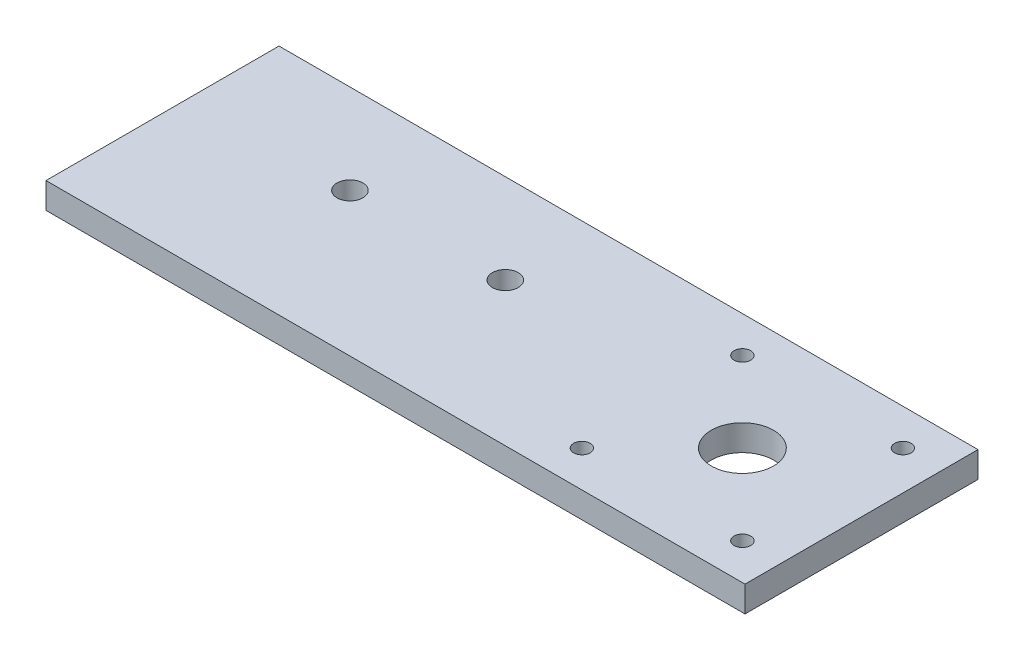
ISO-10303-21;
HEADER;
FILE_DESCRIPTION(('STEP AP214'),'2;1');
FILE_NAME('part.step','',(''),(''),'','','');
FILE_SCHEMA(('AUTOMOTIVE_DESIGN { 1 0 10303 214 1 1 1 1 }'));
ENDSEC;
DATA;
#1=APPLICATION_CONTEXT('core data for automotive mechanical design processes');
#2=APPLICATION_PROTOCOL_DEFINITION('international standard','automotive_design',2000,#1);
#3=PRODUCT_CONTEXT('',#1,'mechanical');
#4=PRODUCT('Part','Part','',(#3));
#5=PRODUCT_RELATED_PRODUCT_CATEGORY('part','',(#4));
#6=PRODUCT_DEFINITION_FORMATION('','',#4);
#7=PRODUCT_DEFINITION_CONTEXT('part definition',#1,'design');
#8=PRODUCT_DEFINITION('design','',#6,#7);
#9=PRODUCT_DEFINITION_SHAPE('','',#8);
#10=(LENGTH_UNIT() NAMED_UNIT(*) SI_UNIT(.MILLI.,.METRE.));
#11=(NAMED_UNIT(*) PLANE_ANGLE_UNIT() SI_UNIT($,.RADIAN.));
#12=(NAMED_UNIT(*) SI_UNIT($,.STERADIAN.) SOLID_ANGLE_UNIT());
#13=UNCERTAINTY_MEASURE_WITH_UNIT(LENGTH_MEASURE(1.E-05),#10,'distance_accuracy_value','');
#14=(GEOMETRIC_REPRESENTATION_CONTEXT(3) GLOBAL_UNCERTAINTY_ASSIGNED_CONTEXT((#13)) GLOBAL_UNIT_ASSIGNED_CONTEXT((#10,
#11,#12)) REPRESENTATION_CONTEXT('',''));
#15=CARTESIAN_POINT('',(0.,0.,0.));
#16=DIRECTION('',(0.,0.,1.));
#17=DIRECTION('',(1.,0.,0.));
#18=AXIS2_PLACEMENT_3D('',#15,#16,#17);
#19=CARTESIAN_POINT('',(67.5,5.,-22.5));
#20=DIRECTION('',(-1.,0.,0.));
#21=DIRECTION('',(0.,0.,1.));
#22=AXIS2_PLACEMENT_3D('',#19,#20,#21);
#23=PLANE('',#22);
#24=DIRECTION('',(0.,0.,-1.));
#25=VECTOR('',#24,1.);
#26=CARTESIAN_POINT('',(67.5,0.,-22.5));
#27=LINE('',#26,#25);
#28=CARTESIAN_POINT('',(67.5,0.,22.5));
#29=VERTEX_POINT('',#28);
#30=CARTESIAN_POINT('',(67.5,0.,-22.5));
#31=VERTEX_POINT('',#30);
#32=EDGE_CURVE('E107',#29,#31,#27,.T.);
#33=ORIENTED_EDGE('',*,*,#32,.T.);
#34=DIRECTION('',(0.,-1.,0.));
#35=VECTOR('',#34,1.);
#36=CARTESIAN_POINT('',(67.5,5.,-22.5));
#37=LINE('',#36,#35);
#38=CARTESIAN_POINT('',(67.5,5.,-22.5));
#39=VERTEX_POINT('',#38);
#40=EDGE_CURVE('E13',#39,#31,#37,.T.);
#41=ORIENTED_EDGE('',*,*,#40,.F.);
#42=DIRECTION('',(0.,0.,-1.));
#43=VECTOR('',#42,1.);
#44=CARTESIAN_POINT('',(67.5,5.,-22.5));
#45=LINE('',#44,#43);
#46=CARTESIAN_POINT('',(67.5,5.,22.5));
#47=VERTEX_POINT('',#46);
#48=EDGE_CURVE('E95',#47,#39,#45,.T.);
#49=ORIENTED_EDGE('',*,*,#48,.F.);
#50=DIRECTION('',(0.,-1.,0.));
#51=VECTOR('',#50,1.);
#52=CARTESIAN_POINT('',(67.5,5.,22.5));
#53=LINE('',#52,#51);
#54=EDGE_CURVE('E103',#47,#29,#53,.T.);
#55=ORIENTED_EDGE('',*,*,#54,.T.);
#56=EDGE_LOOP('',(#33,#41,#49,#55));
#57=FACE_BOUND('',#56,.T.);
#58=ADVANCED_FACE('F44',(#57),#23,.F.);
#59=CARTESIAN_POINT('',(-67.5,5.,-22.5));
#60=DIRECTION('',(0.,0.,1.));
#61=DIRECTION('',(1.,0.,0.));
#62=AXIS2_PLACEMENT_3D('',#59,#60,#61);
#63=PLANE('',#62);
#64=DIRECTION('',(-1.,0.,0.));
#65=VECTOR('',#64,1.);
#66=CARTESIAN_POINT('',(-67.5,0.,-22.5));
#67=LINE('',#66,#65);
#68=CARTESIAN_POINT('',(-67.5,0.,-22.5));
#69=VERTEX_POINT('',#68);
#70=EDGE_CURVE('E99',#31,#69,#67,.T.);
#71=ORIENTED_EDGE('',*,*,#70,.T.);
#72=DIRECTION('',(0.,-1.,0.));
#73=VECTOR('',#72,1.);
#74=CARTESIAN_POINT('',(-67.5,5.,-22.5));
#75=LINE('',#74,#73);
#76=CARTESIAN_POINT('',(-67.5,5.,-22.5));
#77=VERTEX_POINT('',#76);
#78=EDGE_CURVE('E52',#77,#69,#75,.T.);
#79=ORIENTED_EDGE('',*,*,#78,.F.);
#80=DIRECTION('',(-1.,0.,0.));
#81=VECTOR('',#80,1.);
#82=CARTESIAN_POINT('',(-67.5,5.,-22.5));
#83=LINE('',#82,#81);
#84=EDGE_CURVE('E90',#39,#77,#83,.T.);
#85=ORIENTED_EDGE('',*,*,#84,.F.);
#86=ORIENTED_EDGE('',*,*,#40,.T.);
#87=EDGE_LOOP('',(#71,#79,#85,#86));
#88=FACE_BOUND('',#87,.T.);
#89=ADVANCED_FACE('F98',(#88),#63,.F.);
#90=CARTESIAN_POINT('',(-67.5,5.,-22.5));
#91=DIRECTION('',(1.,0.,0.));
#92=DIRECTION('',(0.,0.,-1.));
#93=AXIS2_PLACEMENT_3D('',#90,#91,#92);
#94=PLANE('',#93);
#95=DIRECTION('',(0.,0.,1.));
#96=VECTOR('',#95,1.);
#97=CARTESIAN_POINT('',(-67.5,0.,-22.5));
#98=LINE('',#97,#96);
#99=CARTESIAN_POINT('',(-67.5,0.,22.5));
#100=VERTEX_POINT('',#99);
#101=EDGE_CURVE('E77',#69,#100,#98,.T.);
#102=ORIENTED_EDGE('',*,*,#101,.T.);
#103=DIRECTION('',(0.,-1.,0.));
#104=VECTOR('',#103,1.);
#105=CARTESIAN_POINT('',(-67.5,5.,22.5));
#106=LINE('',#105,#104);
#107=CARTESIAN_POINT('',(-67.5,5.,22.5));
#108=VERTEX_POINT('',#107);
#109=EDGE_CURVE('E100',#108,#100,#106,.T.);
#110=ORIENTED_EDGE('',*,*,#109,.F.);
#111=DIRECTION('',(0.,0.,1.));
#112=VECTOR('',#111,1.);
#113=CARTESIAN_POINT('',(-67.5,5.,-22.5));
#114=LINE('',#113,#112);
#115=EDGE_CURVE('E93',#77,#108,#114,.T.);
#116=ORIENTED_EDGE('',*,*,#115,.F.);
#117=ORIENTED_EDGE('',*,*,#78,.T.);
#118=EDGE_LOOP('',(#102,#110,#116,#117));
#119=FACE_BOUND('',#118,.T.);
#120=ADVANCED_FACE('F101',(#119),#94,.F.);
#121=CARTESIAN_POINT('',(-67.5,5.,22.5));
#122=DIRECTION('',(0.,0.,-1.));
#123=DIRECTION('',(-1.,0.,0.));
#124=AXIS2_PLACEMENT_3D('',#121,#122,#123);
#125=PLANE('',#124);
#126=DIRECTION('',(1.,0.,0.));
#127=VECTOR('',#126,1.);
#128=CARTESIAN_POINT('',(-67.5,0.,22.5));
#129=LINE('',#128,#127);
#130=EDGE_CURVE('E83',#100,#29,#129,.T.);
#131=ORIENTED_EDGE('',*,*,#130,.T.);
#132=ORIENTED_EDGE('',*,*,#54,.F.);
#133=DIRECTION('',(1.,0.,0.));
#134=VECTOR('',#133,1.);
#135=CARTESIAN_POINT('',(-67.5,5.,22.5));
#136=LINE('',#135,#134);
#137=EDGE_CURVE('E60',#108,#47,#136,.T.);
#138=ORIENTED_EDGE('',*,*,#137,.F.);
#139=ORIENTED_EDGE('',*,*,#109,.T.);
#140=EDGE_LOOP('',(#131,#132,#138,#139));
#141=FACE_BOUND('',#140,.T.);
#142=ADVANCED_FACE('F115',(#141),#125,.F.);
#143=CARTESIAN_POINT('',(0.,5.,0.));
#144=DIRECTION('',(0.,1.,0.));
#145=DIRECTION('',(0.,0.,1.));
#146=AXIS2_PLACEMENT_3D('',#143,#144,#145);
#147=PLANE('',#146);
#148=CARTESIAN_POINT('',(60.,5.,15.5025407257454));
#149=DIRECTION('',(0.,-1.,0.));
#150=DIRECTION('',(0.,0.,-1.));
#151=AXIS2_PLACEMENT_3D('',#148,#149,#150);
#152=CIRCLE('',#151,1.6);
#153=CARTESIAN_POINT('',(60.,5.,13.9025407257454));
#154=VERTEX_POINT('',#153);
#155=EDGE_CURVE('E136',#154,#154,#152,.T.);
#156=ORIENTED_EDGE('',*,*,#155,.T.);
#157=EDGE_LOOP('',(#156));
#158=FACE_BOUND('',#157,.T.);
#159=CARTESIAN_POINT('',(29.,5.,15.5025407257454));
#160=DIRECTION('',(0.,-1.,0.));
#161=DIRECTION('',(0.,0.,-1.));
#162=AXIS2_PLACEMENT_3D('',#159,#160,#161);
#163=CIRCLE('',#162,1.6);
#164=CARTESIAN_POINT('',(29.,5.,13.9025407257454));
#165=VERTEX_POINT('',#164);
#166=EDGE_CURVE('E154',#165,#165,#163,.T.);
#167=ORIENTED_EDGE('',*,*,#166,.T.);
#168=EDGE_LOOP('',(#167));
#169=FACE_BOUND('',#168,.T.);
#170=CARTESIAN_POINT('',(29.,5.,-15.4974592742546));
#171=DIRECTION('',(0.,-1.,0.));
#172=DIRECTION('',(0.,0.,-1.));
#173=AXIS2_PLACEMENT_3D('',#170,#171,#172);
#174=CIRCLE('',#173,1.6);
#175=CARTESIAN_POINT('',(29.,5.,-17.0974592742546));
#176=VERTEX_POINT('',#175);
#177=EDGE_CURVE('E148',#176,#176,#174,.T.);
#178=ORIENTED_EDGE('',*,*,#177,.T.);
#179=EDGE_LOOP('',(#178));
#180=FACE_BOUND('',#179,.T.);
#181=CARTESIAN_POINT('',(60.,5.,-15.4974592742546));
#182=DIRECTION('',(0.,-1.,0.));
#183=DIRECTION('',(0.,0.,-1.));
#184=AXIS2_PLACEMENT_3D('',#181,#182,#183);
#185=CIRCLE('',#184,1.6);
#186=CARTESIAN_POINT('',(60.,5.,-17.0974592742546));
#187=VERTEX_POINT('',#186);
#188=EDGE_CURVE('E142',#187,#187,#185,.T.);
#189=ORIENTED_EDGE('',*,*,#188,.T.);
#190=EDGE_LOOP('',(#189));
#191=FACE_BOUND('',#190,.T.);
#192=CARTESIAN_POINT('',(44.5000000000001,5.,0.00254072574537578));
#193=DIRECTION('',(0.,-1.,0.));
#194=DIRECTION('',(0.,0.,-1.));
#195=AXIS2_PLACEMENT_3D('',#192,#193,#194);
#196=CIRCLE('',#195,6.);
#197=CARTESIAN_POINT('',(44.5000000000001,5.,-5.99745927425463));
#198=VERTEX_POINT('',#197);
#199=EDGE_CURVE('E130',#198,#198,#196,.T.);
#200=ORIENTED_EDGE('',*,*,#199,.T.);
#201=EDGE_LOOP('',(#200));
#202=FACE_BOUND('',#201,.T.);
#203=CARTESIAN_POINT('',(-6.49618891138249,5.,-5.19872963712735));
#204=DIRECTION('',(0.,1.,0.));
#205=DIRECTION('',(0.,0.,1.));
#206=AXIS2_PLACEMENT_3D('',#203,#204,#205);
#207=CIRCLE('',#206,2.5);
#208=CARTESIAN_POINT('',(-6.49618891138249,5.,-2.69872963712735));
#209=VERTEX_POINT('',#208);
#210=EDGE_CURVE('E127',#209,#209,#207,.F.);
#211=ORIENTED_EDGE('',*,*,#210,.T.);
#212=EDGE_LOOP('',(#211));
#213=FACE_BOUND('',#212,.T.);
#214=CARTESIAN_POINT('',(-36.4987296371275,5.,-5.19872963712732));
#215=DIRECTION('',(0.,1.,0.));
#216=DIRECTION('',(0.,0.,1.));
#217=AXIS2_PLACEMENT_3D('',#214,#215,#216);
#218=CIRCLE('',#217,2.5);
#219=CARTESIAN_POINT('',(-36.4987296371275,5.,-2.69872963712732));
#220=VERTEX_POINT('',#219);
#221=EDGE_CURVE('E121',#220,#220,#218,.F.);
#222=ORIENTED_EDGE('',*,*,#221,.T.);
#223=EDGE_LOOP('',(#222));
#224=FACE_BOUND('',#223,.T.);
#225=ORIENTED_EDGE('',*,*,#48,.T.);
#226=ORIENTED_EDGE('',*,*,#84,.T.);
#227=ORIENTED_EDGE('',*,*,#115,.T.);
#228=ORIENTED_EDGE('',*,*,#137,.T.);
#229=EDGE_LOOP('',(#225,#226,#227,#228));
#230=FACE_BOUND('',#229,.T.);
#231=ADVANCED_FACE('F91',(#158,#169,#180,#191,#202,#213,#224,#230),#147,.T.);
#232=CARTESIAN_POINT('',(0.,0.,0.));
#233=DIRECTION('',(0.,1.,0.));
#234=DIRECTION('',(0.,0.,1.));
#235=AXIS2_PLACEMENT_3D('',#232,#233,#234);
#236=PLANE('',#235);
#237=CARTESIAN_POINT('',(60.,0.,15.5025407257454));
#238=DIRECTION('',(0.,-1.,0.));
#239=DIRECTION('',(0.,0.,-1.));
#240=AXIS2_PLACEMENT_3D('',#237,#238,#239);
#241=CIRCLE('',#240,1.6);
#242=CARTESIAN_POINT('',(60.,0.,13.9025407257454));
#243=VERTEX_POINT('',#242);
#244=EDGE_CURVE('E157',#243,#243,#241,.T.);
#245=ORIENTED_EDGE('',*,*,#244,.F.);
#246=EDGE_LOOP('',(#245));
#247=FACE_BOUND('',#246,.T.);
#248=CARTESIAN_POINT('',(29.,0.,15.5025407257454));
#249=DIRECTION('',(0.,-1.,0.));
#250=DIRECTION('',(0.,0.,-1.));
#251=AXIS2_PLACEMENT_3D('',#248,#249,#250);
#252=CIRCLE('',#251,1.6);
#253=CARTESIAN_POINT('',(29.,0.,13.9025407257454));
#254=VERTEX_POINT('',#253);
#255=EDGE_CURVE('E151',#254,#254,#252,.T.);
#256=ORIENTED_EDGE('',*,*,#255,.F.);
#257=EDGE_LOOP('',(#256));
#258=FACE_BOUND('',#257,.T.);
#259=CARTESIAN_POINT('',(29.,0.,-15.4974592742546));
#260=DIRECTION('',(0.,-1.,0.));
#261=DIRECTION('',(0.,0.,-1.));
#262=AXIS2_PLACEMENT_3D('',#259,#260,#261);
#263=CIRCLE('',#262,1.6);
#264=CARTESIAN_POINT('',(29.,0.,-17.0974592742546));
#265=VERTEX_POINT('',#264);
#266=EDGE_CURVE('E145',#265,#265,#263,.T.);
#267=ORIENTED_EDGE('',*,*,#266,.F.);
#268=EDGE_LOOP('',(#267));
#269=FACE_BOUND('',#268,.T.);
#270=CARTESIAN_POINT('',(60.,0.,-15.4974592742546));
#271=DIRECTION('',(0.,-1.,0.));
#272=DIRECTION('',(0.,0.,-1.));
#273=AXIS2_PLACEMENT_3D('',#270,#271,#272);
#274=CIRCLE('',#273,1.6);
#275=CARTESIAN_POINT('',(60.,0.,-17.0974592742546));
#276=VERTEX_POINT('',#275);
#277=EDGE_CURVE('E139',#276,#276,#274,.T.);
#278=ORIENTED_EDGE('',*,*,#277,.F.);
#279=EDGE_LOOP('',(#278));
#280=FACE_BOUND('',#279,.T.);
#281=CARTESIAN_POINT('',(44.5000000000001,0.,0.00254072574537578));
#282=DIRECTION('',(0.,-1.,0.));
#283=DIRECTION('',(0.,0.,-1.));
#284=AXIS2_PLACEMENT_3D('',#281,#282,#283);
#285=CIRCLE('',#284,6.);
#286=CARTESIAN_POINT('',(44.5000000000001,0.,-5.99745927425463));
#287=VERTEX_POINT('',#286);
#288=EDGE_CURVE('E133',#287,#287,#285,.T.);
#289=ORIENTED_EDGE('',*,*,#288,.F.);
#290=EDGE_LOOP('',(#289));
#291=FACE_BOUND('',#290,.T.);
#292=CARTESIAN_POINT('',(-6.49618891138249,0.,-5.19872963712735));
#293=DIRECTION('',(0.,-1.,0.));
#294=DIRECTION('',(0.,0.,-1.));
#295=AXIS2_PLACEMENT_3D('',#292,#293,#294);
#296=CIRCLE('',#295,2.5);
#297=CARTESIAN_POINT('',(-6.49618891138249,0.,-7.69872963712735));
#298=VERTEX_POINT('',#297);
#299=EDGE_CURVE('E124',#298,#298,#296,.T.);
#300=ORIENTED_EDGE('',*,*,#299,.F.);
#301=EDGE_LOOP('',(#300));
#302=FACE_BOUND('',#301,.T.);
#303=CARTESIAN_POINT('',(-36.4987296371275,0.,-5.19872963712732));
#304=DIRECTION('',(0.,-1.,0.));
#305=DIRECTION('',(0.,0.,-1.));
#306=AXIS2_PLACEMENT_3D('',#303,#304,#305);
#307=CIRCLE('',#306,2.5);
#308=CARTESIAN_POINT('',(-36.4987296371275,0.,-7.69872963712732));
#309=VERTEX_POINT('',#308);
#310=EDGE_CURVE('E110',#309,#309,#307,.T.);
#311=ORIENTED_EDGE('',*,*,#310,.F.);
#312=EDGE_LOOP('',(#311));
#313=FACE_BOUND('',#312,.T.);
#314=ORIENTED_EDGE('',*,*,#32,.F.);
#315=ORIENTED_EDGE('',*,*,#130,.F.);
#316=ORIENTED_EDGE('',*,*,#101,.F.);
#317=ORIENTED_EDGE('',*,*,#70,.F.);
#318=EDGE_LOOP('',(#314,#315,#316,#317));
#319=FACE_BOUND('',#318,.T.);
#320=ADVANCED_FACE('F118',(#247,#258,#269,#280,#291,#302,#313,#319),#236,.F.);
#321=CARTESIAN_POINT('',(-36.4987296371275,5.00099999999998,-5.19872963712732));
#322=DIRECTION('',(0.,-1.,0.));
#323=DIRECTION('',(0.,0.,-1.));
#324=AXIS2_PLACEMENT_3D('',#321,#322,#323);
#325=CYLINDRICAL_SURFACE('',#324,2.5);
#326=ORIENTED_EDGE('',*,*,#221,.F.);
#327=EDGE_LOOP('',(#326));
#328=FACE_BOUND('',#327,.T.);
#329=ORIENTED_EDGE('',*,*,#310,.T.);
#330=EDGE_LOOP('',(#329));
#331=FACE_BOUND('',#330,.T.);
#332=ADVANCED_FACE('F174',(#328,#331),#325,.F.);
#333=CARTESIAN_POINT('',(-6.49618891138249,5.00099999999998,-5.19872963712735));
#334=DIRECTION('',(0.,-1.,0.));
#335=DIRECTION('',(0.,0.,-1.));
#336=AXIS2_PLACEMENT_3D('',#333,#334,#335);
#337=CYLINDRICAL_SURFACE('',#336,2.5);
#338=ORIENTED_EDGE('',*,*,#210,.F.);
#339=EDGE_LOOP('',(#338));
#340=FACE_BOUND('',#339,.T.);
#341=ORIENTED_EDGE('',*,*,#299,.T.);
#342=EDGE_LOOP('',(#341));
#343=FACE_BOUND('',#342,.T.);
#344=ADVANCED_FACE('F189',(#340,#343),#337,.F.);
#345=CARTESIAN_POINT('',(44.5000000000001,5.,0.00254072574537578));
#346=DIRECTION('',(0.,-1.,0.));
#347=DIRECTION('',(0.,0.,-1.));
#348=AXIS2_PLACEMENT_3D('',#345,#346,#347);
#349=CYLINDRICAL_SURFACE('',#348,6.);
#350=ORIENTED_EDGE('',*,*,#199,.F.);
#351=EDGE_LOOP('',(#350));
#352=FACE_BOUND('',#351,.T.);
#353=ORIENTED_EDGE('',*,*,#288,.T.);
#354=EDGE_LOOP('',(#353));
#355=FACE_BOUND('',#354,.T.);
#356=ADVANCED_FACE('F195',(#352,#355),#349,.F.);
#357=CARTESIAN_POINT('',(60.,5.,-15.4974592742546));
#358=DIRECTION('',(0.,-1.,0.));
#359=DIRECTION('',(0.,0.,-1.));
#360=AXIS2_PLACEMENT_3D('',#357,#358,#359);
#361=CYLINDRICAL_SURFACE('',#360,1.6);
#362=ORIENTED_EDGE('',*,*,#188,.F.);
#363=EDGE_LOOP('',(#362));
#364=FACE_BOUND('',#363,.T.);
#365=ORIENTED_EDGE('',*,*,#277,.T.);
#366=EDGE_LOOP('',(#365));
#367=FACE_BOUND('',#366,.T.);
#368=ADVANCED_FACE('F232',(#364,#367),#361,.F.);
#369=CARTESIAN_POINT('',(29.,5.,-15.4974592742546));
#370=DIRECTION('',(0.,-1.,0.));
#371=DIRECTION('',(0.,0.,-1.));
#372=AXIS2_PLACEMENT_3D('',#369,#370,#371);
#373=CYLINDRICAL_SURFACE('',#372,1.6);
#374=ORIENTED_EDGE('',*,*,#177,.F.);
#375=EDGE_LOOP('',(#374));
#376=FACE_BOUND('',#375,.T.);
#377=ORIENTED_EDGE('',*,*,#266,.T.);
#378=EDGE_LOOP('',(#377));
#379=FACE_BOUND('',#378,.T.);
#380=ADVANCED_FACE('F240',(#376,#379),#373,.F.);
#381=CARTESIAN_POINT('',(29.,5.,15.5025407257454));
#382=DIRECTION('',(0.,-1.,0.));
#383=DIRECTION('',(0.,0.,-1.));
#384=AXIS2_PLACEMENT_3D('',#381,#382,#383);
#385=CYLINDRICAL_SURFACE('',#384,1.6);
#386=ORIENTED_EDGE('',*,*,#166,.F.);
#387=EDGE_LOOP('',(#386));
#388=FACE_BOUND('',#387,.T.);
#389=ORIENTED_EDGE('',*,*,#255,.T.);
#390=EDGE_LOOP('',(#389));
#391=FACE_BOUND('',#390,.T.);
#392=ADVANCED_FACE('F168',(#388,#391),#385,.F.);
#393=CARTESIAN_POINT('',(60.,5.,15.5025407257454));
#394=DIRECTION('',(0.,-1.,0.));
#395=DIRECTION('',(0.,0.,-1.));
#396=AXIS2_PLACEMENT_3D('',#393,#394,#395);
#397=CYLINDRICAL_SURFACE('',#396,1.6);
#398=ORIENTED_EDGE('',*,*,#155,.F.);
#399=EDGE_LOOP('',(#398));
#400=FACE_BOUND('',#399,.T.);
#401=ORIENTED_EDGE('',*,*,#244,.T.);
#402=EDGE_LOOP('',(#401));
#403=FACE_BOUND('',#402,.T.);
#404=ADVANCED_FACE('F165',(#400,#403),#397,.F.);
#405=CLOSED_SHELL('',(#58,#89,#120,#142,#231,#320,#332,#344,#356,#368,#380,#392,#404));
#406=MANIFOLD_SOLID_BREP('B2',#405);
#407=ADVANCED_BREP_SHAPE_REPRESENTATION('',(#18,#406),#14);
#408=SHAPE_DEFINITION_REPRESENTATION(#9,#407);
ENDSEC;
END-ISO-10303-21;
